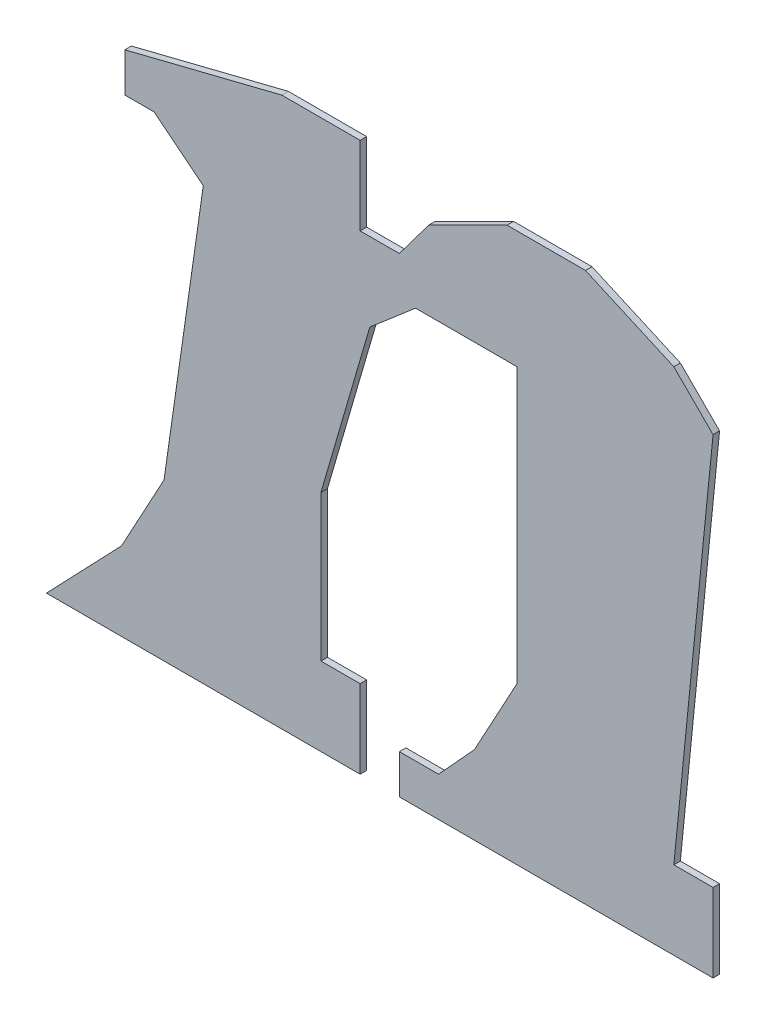
ISO-10303-21;
HEADER;
FILE_DESCRIPTION(('STEP AP214'),'2;1');
FILE_NAME('part.step','',(''),(''),'','','');
FILE_SCHEMA(('AUTOMOTIVE_DESIGN { 1 0 10303 214 1 1 1 1 }'));
ENDSEC;
DATA;
#1=APPLICATION_CONTEXT('core data for automotive mechanical design processes');
#2=APPLICATION_PROTOCOL_DEFINITION('international standard','automotive_design',2000,#1);
#3=PRODUCT_CONTEXT('',#1,'mechanical');
#4=PRODUCT('Part','Part','',(#3));
#5=PRODUCT_RELATED_PRODUCT_CATEGORY('part','',(#4));
#6=PRODUCT_DEFINITION_FORMATION('','',#4);
#7=PRODUCT_DEFINITION_CONTEXT('part definition',#1,'design');
#8=PRODUCT_DEFINITION('design','',#6,#7);
#9=PRODUCT_DEFINITION_SHAPE('','',#8);
#10=(LENGTH_UNIT() NAMED_UNIT(*) SI_UNIT(.MILLI.,.METRE.));
#11=(NAMED_UNIT(*) PLANE_ANGLE_UNIT() SI_UNIT($,.RADIAN.));
#12=(NAMED_UNIT(*) SI_UNIT($,.STERADIAN.) SOLID_ANGLE_UNIT());
#13=UNCERTAINTY_MEASURE_WITH_UNIT(LENGTH_MEASURE(1.E-05),#10,'distance_accuracy_value','');
#14=(GEOMETRIC_REPRESENTATION_CONTEXT(3) GLOBAL_UNCERTAINTY_ASSIGNED_CONTEXT((#13)) GLOBAL_UNIT_ASSIGNED_CONTEXT((#10,
#11,#12)) REPRESENTATION_CONTEXT('',''));
#15=CARTESIAN_POINT('',(0.,0.,0.));
#16=DIRECTION('',(0.,0.,1.));
#17=DIRECTION('',(1.,0.,0.));
#18=AXIS2_PLACEMENT_3D('',#15,#16,#17);
#19=CARTESIAN_POINT('',(-0.50999898,-0.41999916,0.));
#20=DIRECTION('',(0.,0.,-1.));
#21=DIRECTION('',(-1.,0.,0.));
#22=AXIS2_PLACEMENT_3D('',#19,#20,#21);
#23=PLANE('',#22);
#24=DIRECTION('',(0.,1.,0.));
#25=VECTOR('',#24,1.);
#26=CARTESIAN_POINT('',(-0.02999994000001,-0.2999994,0.));
#27=LINE('',#26,#25);
#28=CARTESIAN_POINT('',(-0.02999994000001,-0.41999916,0.));
#29=VERTEX_POINT('',#28);
#30=CARTESIAN_POINT('',(-0.02999994000001,-0.2999994,0.));
#31=VERTEX_POINT('',#30);
#32=EDGE_CURVE('E372',#29,#31,#27,.T.);
#33=ORIENTED_EDGE('',*,*,#32,.F.);
#34=DIRECTION('',(1.,0.,0.));
#35=VECTOR('',#34,1.);
#36=CARTESIAN_POINT('',(-0.02999994000001,-0.41999916,0.));
#37=LINE('',#36,#35);
#38=CARTESIAN_POINT('',(-0.50999898,-0.41999916,0.));
#39=VERTEX_POINT('',#38);
#40=EDGE_CURVE('E220',#39,#29,#37,.T.);
#41=ORIENTED_EDGE('',*,*,#40,.F.);
#42=DIRECTION('',(-0.691351111248092,-0.722518955444096,0.));
#43=VECTOR('',#42,1.);
#44=CARTESIAN_POINT('',(-0.50999898,-0.41999916,0.));
#45=LINE('',#44,#43);
#46=CARTESIAN_POINT('',(-0.395175740000001,-0.299999399999999,0.));
#47=VERTEX_POINT('',#46);
#48=EDGE_CURVE('E20',#47,#39,#45,.T.);
#49=ORIENTED_EDGE('',*,*,#48,.F.);
#50=DIRECTION('',(-0.477274509659104,-0.878754255995191,0.));
#51=VECTOR('',#50,1.);
#52=CARTESIAN_POINT('',(-0.39517574,-0.2999994,0.));
#53=LINE('',#52,#51);
#54=CARTESIAN_POINT('',(-0.329999339999991,-0.179997100000005,0.));
#55=VERTEX_POINT('',#54);
#56=EDGE_CURVE('E217',#55,#47,#53,.T.);
#57=ORIENTED_EDGE('',*,*,#56,.F.);
#58=DIRECTION('',(-0.14142135623703,-0.989949493661207,0.));
#59=VECTOR('',#58,1.);
#60=CARTESIAN_POINT('',(-0.32999934,-0.1799971,0.));
#61=LINE('',#60,#59);
#62=CARTESIAN_POINT('',(-0.269999460000059,0.240002060000009,0.));
#63=VERTEX_POINT('',#62);
#64=EDGE_CURVE('E238',#63,#55,#61,.T.);
#65=ORIENTED_EDGE('',*,*,#64,.F.);
#66=DIRECTION('',(0.781584520739364,-0.623799356316291,0.));
#67=VECTOR('',#66,1.);
#68=CARTESIAN_POINT('',(-0.26999946,0.24000206,0.));
#69=LINE('',#68,#67);
#70=CARTESIAN_POINT('',(-0.34517584000001,0.300001939999988,0.));
#71=VERTEX_POINT('',#70);
#72=EDGE_CURVE('E242',#71,#63,#69,.T.);
#73=ORIENTED_EDGE('',*,*,#72,.F.);
#74=DIRECTION('',(1.,0.,0.));
#75=VECTOR('',#74,1.);
#76=CARTESIAN_POINT('',(-0.34517584,0.30000194,0.));
#77=LINE('',#76,#75);
#78=CARTESIAN_POINT('',(-0.38999922,0.30000194,0.));
#79=VERTEX_POINT('',#78);
#80=EDGE_CURVE('E247',#79,#71,#77,.T.);
#81=ORIENTED_EDGE('',*,*,#80,.F.);
#82=DIRECTION('',(0.,1.,0.));
#83=VECTOR('',#82,1.);
#84=CARTESIAN_POINT('',(-0.38999922,0.30000194,0.));
#85=LINE('',#84,#83);
#86=CARTESIAN_POINT('',(-0.38999922,0.36000182,0.));
#87=VERTEX_POINT('',#86);
#88=EDGE_CURVE('E252',#87,#79,#85,.F.);
#89=ORIENTED_EDGE('',*,*,#88,.F.);
#90=DIRECTION('',(-0.970142500145391,-0.242535625036098,0.));
#91=VECTOR('',#90,1.);
#92=CARTESIAN_POINT('',(-0.38999922,0.36000182,0.));
#93=LINE('',#92,#91);
#94=CARTESIAN_POINT('',(-0.149999699999993,0.420001699999971,0.));
#95=VERTEX_POINT('',#94);
#96=EDGE_CURVE('E257',#95,#87,#93,.T.);
#97=ORIENTED_EDGE('',*,*,#96,.F.);
#98=DIRECTION('',(1.,0.,0.));
#99=VECTOR('',#98,1.);
#100=CARTESIAN_POINT('',(-0.1499997,0.4200017,0.));
#101=LINE('',#100,#99);
#102=CARTESIAN_POINT('',(-0.02999994000001,0.4200017,0.));
#103=VERTEX_POINT('',#102);
#104=EDGE_CURVE('E262',#103,#95,#101,.F.);
#105=ORIENTED_EDGE('',*,*,#104,.F.);
#106=DIRECTION('',(0.,1.,0.));
#107=VECTOR('',#106,1.);
#108=CARTESIAN_POINT('',(-0.02999994000001,0.4200017,0.));
#109=LINE('',#108,#107);
#110=CARTESIAN_POINT('',(-0.02999994000001,0.30000194,0.));
#111=VERTEX_POINT('',#110);
#112=EDGE_CURVE('E267',#111,#103,#109,.T.);
#113=ORIENTED_EDGE('',*,*,#112,.F.);
#114=DIRECTION('',(1.,0.,0.));
#115=VECTOR('',#114,1.);
#116=CARTESIAN_POINT('',(-0.02999994000001,0.30000194,0.));
#117=LINE('',#116,#115);
#118=CARTESIAN_POINT('',(0.03000247999999,0.30000194,0.));
#119=VERTEX_POINT('',#118);
#120=EDGE_CURVE('E272',#119,#111,#117,.F.);
#121=ORIENTED_EDGE('',*,*,#120,.F.);
#122=DIRECTION('',(-0.598468645884806,-0.80114622878274,0.));
#123=VECTOR('',#122,1.);
#124=CARTESIAN_POINT('',(0.03000247999999,0.30000194,0.));
#125=LINE('',#124,#123);
#126=CARTESIAN_POINT('',(0.0748233199999805,0.360001820000007,0.));
#127=VERTEX_POINT('',#126);
#128=EDGE_CURVE('E277',#127,#119,#125,.T.);
#129=ORIENTED_EDGE('',*,*,#128,.F.);
#130=DIRECTION('',(-0.894427190999916,-0.447213595499958,0.));
#131=VECTOR('',#130,1.);
#132=CARTESIAN_POINT('',(0.07482331999999,0.36000182,0.));
#133=LINE('',#132,#131);
#134=CARTESIAN_POINT('',(0.194823079999999,0.420001700000002,0.));
#135=VERTEX_POINT('',#134);
#136=EDGE_CURVE('E282',#135,#127,#133,.T.);
#137=ORIENTED_EDGE('',*,*,#136,.F.);
#138=DIRECTION('',(1.,0.,0.));
#139=VECTOR('',#138,1.);
#140=CARTESIAN_POINT('',(0.19482308,0.4200017,0.));
#141=LINE('',#140,#139);
#142=CARTESIAN_POINT('',(0.31482284,0.4200017,0.));
#143=VERTEX_POINT('',#142);
#144=EDGE_CURVE('E287',#143,#135,#141,.F.);
#145=ORIENTED_EDGE('',*,*,#144,.F.);
#146=DIRECTION('',(-0.914011154655173,0.405689054777077,0.));
#147=VECTOR('',#146,1.);
#148=CARTESIAN_POINT('',(0.31482284,0.4200017,0.));
#149=LINE('',#148,#147);
#150=CARTESIAN_POINT('',(0.450001640000015,0.360001820000033,0.));
#151=VERTEX_POINT('',#150);
#152=EDGE_CURVE('E292',#151,#143,#149,.T.);
#153=ORIENTED_EDGE('',*,*,#152,.F.);
#154=DIRECTION('',(-0.707106781186048,0.707106781187048,0.));
#155=VECTOR('',#154,1.);
#156=CARTESIAN_POINT('',(0.45000164,0.36000182,0.));
#157=LINE('',#156,#155);
#158=CARTESIAN_POINT('',(0.510001519999979,0.300001939999979,0.));
#159=VERTEX_POINT('',#158);
#160=EDGE_CURVE('E297',#159,#151,#157,.T.);
#161=ORIENTED_EDGE('',*,*,#160,.F.);
#162=DIRECTION('',(0.0995033019600991,0.995037231915991,0.));
#163=VECTOR('',#162,1.);
#164=CARTESIAN_POINT('',(0.51000152,0.30000194,0.));
#165=LINE('',#164,#163);
#166=CARTESIAN_POINT('',(0.450001640000004,-0.2999994,0.));
#167=VERTEX_POINT('',#166);
#168=EDGE_CURVE('E302',#167,#159,#165,.T.);
#169=ORIENTED_EDGE('',*,*,#168,.F.);
#170=DIRECTION('',(1.,0.,0.));
#171=VECTOR('',#170,1.);
#172=CARTESIAN_POINT('',(0.45000164,-0.2999994,0.));
#173=LINE('',#172,#171);
#174=CARTESIAN_POINT('',(0.51000152,-0.2999994,0.));
#175=VERTEX_POINT('',#174);
#176=EDGE_CURVE('E307',#175,#167,#173,.F.);
#177=ORIENTED_EDGE('',*,*,#176,.F.);
#178=DIRECTION('',(0.,1.,0.));
#179=VECTOR('',#178,1.);
#180=CARTESIAN_POINT('',(0.51000152,-0.2999994,0.));
#181=LINE('',#180,#179);
#182=CARTESIAN_POINT('',(0.51000152,-0.41999916,0.));
#183=VERTEX_POINT('',#182);
#184=EDGE_CURVE('E312',#183,#175,#181,.T.);
#185=ORIENTED_EDGE('',*,*,#184,.F.);
#186=DIRECTION('',(1.,0.,0.));
#187=VECTOR('',#186,1.);
#188=CARTESIAN_POINT('',(0.51000152,-0.41999916,0.));
#189=LINE('',#188,#187);
#190=CARTESIAN_POINT('',(0.03000247999999,-0.41999916,0.));
#191=VERTEX_POINT('',#190);
#192=EDGE_CURVE('E317',#191,#183,#189,.T.);
#193=ORIENTED_EDGE('',*,*,#192,.F.);
#194=DIRECTION('',(0.,1.,0.));
#195=VECTOR('',#194,1.);
#196=CARTESIAN_POINT('',(0.03000247999999,-0.41999916,0.));
#197=LINE('',#196,#195);
#198=CARTESIAN_POINT('',(0.03000247999999,-0.35999928,0.));
#199=VERTEX_POINT('',#198);
#200=EDGE_CURVE('E322',#199,#191,#197,.F.);
#201=ORIENTED_EDGE('',*,*,#200,.F.);
#202=DIRECTION('',(1.,0.,0.));
#203=VECTOR('',#202,1.);
#204=CARTESIAN_POINT('',(0.03000247999999,-0.35999928,0.));
#205=LINE('',#204,#203);
#206=CARTESIAN_POINT('',(0.09000236,-0.35999928,0.));
#207=VERTEX_POINT('',#206);
#208=EDGE_CURVE('E327',#207,#199,#205,.F.);
#209=ORIENTED_EDGE('',*,*,#208,.F.);
#210=DIRECTION('',(-0.674526464992905,-0.738250667472896,0.));
#211=VECTOR('',#210,1.);
#212=CARTESIAN_POINT('',(0.09000236,-0.35999928,0.));
#213=LINE('',#212,#211);
#214=CARTESIAN_POINT('',(0.144823179999995,-0.299999399999996,0.));
#215=VERTEX_POINT('',#214);
#216=EDGE_CURVE('E332',#215,#207,#213,.T.);
#217=ORIENTED_EDGE('',*,*,#216,.F.);
#218=DIRECTION('',(-0.477288872511084,-0.878746455001156,0.));
#219=VECTOR('',#218,1.);
#220=CARTESIAN_POINT('',(0.14482318,-0.2999994,0.));
#221=LINE('',#220,#219);
#222=CARTESIAN_POINT('',(0.210002120000002,-0.179997100000001,0.));
#223=VERTEX_POINT('',#222);
#224=EDGE_CURVE('E337',#223,#215,#221,.T.);
#225=ORIENTED_EDGE('',*,*,#224,.F.);
#226=DIRECTION('',(0.,1.,0.));
#227=VECTOR('',#226,1.);
#228=CARTESIAN_POINT('',(0.21000212,-0.1799971,0.));
#229=LINE('',#228,#227);
#230=CARTESIAN_POINT('',(0.21000212,0.24000206,0.));
#231=VERTEX_POINT('',#230);
#232=EDGE_CURVE('E342',#231,#223,#229,.F.);
#233=ORIENTED_EDGE('',*,*,#232,.F.);
#234=DIRECTION('',(1.,0.,0.));
#235=VECTOR('',#234,1.);
#236=CARTESIAN_POINT('',(0.21000212,0.24000206,0.));
#237=LINE('',#236,#235);
#238=CARTESIAN_POINT('',(0.05482336,0.24000206,0.));
#239=VERTEX_POINT('',#238);
#240=EDGE_CURVE('E347',#239,#231,#237,.T.);
#241=ORIENTED_EDGE('',*,*,#240,.F.);
#242=DIRECTION('',(0.759256602365155,0.650791373456133,0.));
#243=VECTOR('',#242,1.);
#244=CARTESIAN_POINT('',(0.05482336,0.24000206,0.));
#245=LINE('',#244,#243);
#246=CARTESIAN_POINT('',(-0.0151765000000014,0.18000217999999,0.));
#247=VERTEX_POINT('',#246);
#248=EDGE_CURVE('E352',#247,#239,#245,.T.);
#249=ORIENTED_EDGE('',*,*,#248,.F.);
#250=DIRECTION('',(0.279877048661076,0.960035852264261,0.));
#251=VECTOR('',#250,1.);
#252=CARTESIAN_POINT('',(-0.01517650000001,0.18000218,0.));
#253=LINE('',#252,#251);
#254=CARTESIAN_POINT('',(-0.0899998200000719,-0.076657199999979,0.));
#255=VERTEX_POINT('',#254);
#256=EDGE_CURVE('E357',#255,#247,#253,.T.);
#257=ORIENTED_EDGE('',*,*,#256,.F.);
#258=DIRECTION('',(0.,1.,0.));
#259=VECTOR('',#258,1.);
#260=CARTESIAN_POINT('',(-0.08999982,-0.0766572,0.));
#261=LINE('',#260,#259);
#262=CARTESIAN_POINT('',(-0.08999982,-0.2999994,0.));
#263=VERTEX_POINT('',#262);
#264=EDGE_CURVE('E362',#263,#255,#261,.T.);
#265=ORIENTED_EDGE('',*,*,#264,.F.);
#266=DIRECTION('',(1.,0.,0.));
#267=VECTOR('',#266,1.);
#268=CARTESIAN_POINT('',(-0.08999982,-0.2999994,0.));
#269=LINE('',#268,#267);
#270=EDGE_CURVE('E367',#31,#263,#269,.F.);
#271=ORIENTED_EDGE('',*,*,#270,.F.);
#272=EDGE_LOOP('',(#33,#41,#49,#57,#65,#73,#81,#89,#97,#105,#113,#121,#129,#137,#145,#153,#161,
#169,#177,#185,#193,#201,#209,#217,#225,#233,#241,#249,#257,#265,#271));
#273=FACE_BOUND('',#272,.T.);
#274=ADVANCED_FACE('F17',(#273),#23,.T.);
#275=CARTESIAN_POINT('',(-0.50999898,-0.41999916,0.));
#276=DIRECTION('',(-0.722518955444096,0.691351111248092,0.));
#277=DIRECTION('',(-0.691351111248092,-0.722518955444096,0.));
#278=AXIS2_PLACEMENT_3D('',#275,#276,#277);
#279=PLANE('',#278);
#280=DIRECTION('',(0.,0.,1.));
#281=VECTOR('',#280,1.);
#282=CARTESIAN_POINT('',(-0.39517574,-0.2999994,0.));
#283=LINE('',#282,#281);
#284=CARTESIAN_POINT('',(-0.395175740000001,-0.299999399999999,0.01));
#285=VERTEX_POINT('',#284);
#286=EDGE_CURVE('E225',#47,#285,#283,.T.);
#287=ORIENTED_EDGE('',*,*,#286,.F.);
#288=ORIENTED_EDGE('',*,*,#48,.T.);
#289=DIRECTION('',(0.,0.,-1.));
#290=VECTOR('',#289,1.);
#291=CARTESIAN_POINT('',(-0.50999898,-0.41999916,0.));
#292=LINE('',#291,#290);
#293=CARTESIAN_POINT('',(-0.50999898,-0.41999916,0.01));
#294=VERTEX_POINT('',#293);
#295=EDGE_CURVE('E376',#294,#39,#292,.T.);
#296=ORIENTED_EDGE('',*,*,#295,.F.);
#297=DIRECTION('',(0.691351111248103,0.722518955444086,0.));
#298=VECTOR('',#297,1.);
#299=CARTESIAN_POINT('',(-0.50999898,-0.41999916,0.01));
#300=LINE('',#299,#298);
#301=EDGE_CURVE('E235',#294,#285,#300,.T.);
#302=ORIENTED_EDGE('',*,*,#301,.T.);
#303=EDGE_LOOP('',(#287,#288,#296,#302));
#304=FACE_BOUND('',#303,.T.);
#305=ADVANCED_FACE('F234',(#304),#279,.T.);
#306=CARTESIAN_POINT('',(-0.39517574,-0.2999994,0.));
#307=DIRECTION('',(-0.878754255995191,0.477274509659104,0.));
#308=DIRECTION('',(-0.477274509659104,-0.878754255995191,0.));
#309=AXIS2_PLACEMENT_3D('',#306,#307,#308);
#310=PLANE('',#309);
#311=DIRECTION('',(0.,0.,1.));
#312=VECTOR('',#311,1.);
#313=CARTESIAN_POINT('',(-0.32999934,-0.1799971,0.));
#314=LINE('',#313,#312);
#315=CARTESIAN_POINT('',(-0.329999339999991,-0.179997100000005,0.01));
#316=VERTEX_POINT('',#315);
#317=EDGE_CURVE('E231',#55,#316,#314,.T.);
#318=ORIENTED_EDGE('',*,*,#317,.F.);
#319=ORIENTED_EDGE('',*,*,#56,.T.);
#320=ORIENTED_EDGE('',*,*,#286,.T.);
#321=DIRECTION('',(0.477274509658977,0.87875425599526,0.));
#322=VECTOR('',#321,1.);
#323=CARTESIAN_POINT('',(-0.39517574,-0.2999994,0.01));
#324=LINE('',#323,#322);
#325=EDGE_CURVE('E380',#285,#316,#324,.T.);
#326=ORIENTED_EDGE('',*,*,#325,.T.);
#327=EDGE_LOOP('',(#318,#319,#320,#326));
#328=FACE_BOUND('',#327,.T.);
#329=ADVANCED_FACE('F228',(#328),#310,.T.);
#330=CARTESIAN_POINT('',(-0.32999934,-0.1799971,0.));
#331=DIRECTION('',(-0.989949493661207,0.14142135623703,0.));
#332=DIRECTION('',(-0.14142135623703,-0.989949493661207,0.));
#333=AXIS2_PLACEMENT_3D('',#330,#331,#332);
#334=PLANE('',#333);
#335=DIRECTION('',(0.,0.,1.));
#336=VECTOR('',#335,1.);
#337=CARTESIAN_POINT('',(-0.26999946,0.24000206,0.));
#338=LINE('',#337,#336);
#339=CARTESIAN_POINT('',(-0.269999460000059,0.240002060000009,0.01));
#340=VERTEX_POINT('',#339);
#341=EDGE_CURVE('E240',#63,#340,#338,.T.);
#342=ORIENTED_EDGE('',*,*,#341,.F.);
#343=ORIENTED_EDGE('',*,*,#64,.T.);
#344=ORIENTED_EDGE('',*,*,#317,.T.);
#345=DIRECTION('',(0.141421356237309,0.989949493661166,0.));
#346=VECTOR('',#345,1.);
#347=CARTESIAN_POINT('',(-0.32999934,-0.1799971,0.01));
#348=LINE('',#347,#346);
#349=EDGE_CURVE('E382',#316,#340,#348,.T.);
#350=ORIENTED_EDGE('',*,*,#349,.T.);
#351=EDGE_LOOP('',(#342,#343,#344,#350));
#352=FACE_BOUND('',#351,.T.);
#353=ADVANCED_FACE('F576',(#352),#334,.T.);
#354=CARTESIAN_POINT('',(-0.26999946,0.24000206,0.));
#355=DIRECTION('',(-0.623799356316291,-0.781584520739364,0.));
#356=DIRECTION('',(0.781584520739364,-0.623799356316291,0.));
#357=AXIS2_PLACEMENT_3D('',#354,#355,#356);
#358=PLANE('',#357);
#359=DIRECTION('',(0.,0.,-1.));
#360=VECTOR('',#359,1.);
#361=CARTESIAN_POINT('',(-0.34517584,0.30000194,0.));
#362=LINE('',#361,#360);
#363=CARTESIAN_POINT('',(-0.34517584000001,0.300001939999988,0.01));
#364=VERTEX_POINT('',#363);
#365=EDGE_CURVE('E245',#71,#364,#362,.F.);
#366=ORIENTED_EDGE('',*,*,#365,.F.);
#367=ORIENTED_EDGE('',*,*,#72,.T.);
#368=ORIENTED_EDGE('',*,*,#341,.T.);
#369=DIRECTION('',(-0.781584520739166,0.623799356316539,0.));
#370=VECTOR('',#369,1.);
#371=CARTESIAN_POINT('',(-0.26999946,0.24000206,0.01));
#372=LINE('',#371,#370);
#373=EDGE_CURVE('E385',#340,#364,#372,.T.);
#374=ORIENTED_EDGE('',*,*,#373,.T.);
#375=EDGE_LOOP('',(#366,#367,#368,#374));
#376=FACE_BOUND('',#375,.T.);
#377=ADVANCED_FACE('F572',(#376),#358,.T.);
#378=CARTESIAN_POINT('',(-0.34517584,0.30000194,0.));
#379=DIRECTION('',(0.,-1.,0.));
#380=DIRECTION('',(0.,0.,-1.));
#381=AXIS2_PLACEMENT_3D('',#378,#379,#380);
#382=PLANE('',#381);
#383=DIRECTION('',(0.,0.,1.));
#384=VECTOR('',#383,1.);
#385=CARTESIAN_POINT('',(-0.38999922,0.30000194,0.));
#386=LINE('',#385,#384);
#387=CARTESIAN_POINT('',(-0.38999922,0.30000194,0.01));
#388=VERTEX_POINT('',#387);
#389=EDGE_CURVE('E250',#79,#388,#386,.T.);
#390=ORIENTED_EDGE('',*,*,#389,.F.);
#391=ORIENTED_EDGE('',*,*,#80,.T.);
#392=ORIENTED_EDGE('',*,*,#365,.T.);
#393=DIRECTION('',(-1.,0.,0.));
#394=VECTOR('',#393,1.);
#395=CARTESIAN_POINT('',(-0.50999898,0.30000194,0.01));
#396=LINE('',#395,#394);
#397=EDGE_CURVE('E388',#364,#388,#396,.T.);
#398=ORIENTED_EDGE('',*,*,#397,.T.);
#399=EDGE_LOOP('',(#390,#391,#392,#398));
#400=FACE_BOUND('',#399,.T.);
#401=ADVANCED_FACE('F569',(#400),#382,.T.);
#402=CARTESIAN_POINT('',(-0.38999922,0.30000194,0.));
#403=DIRECTION('',(-1.,0.,0.));
#404=DIRECTION('',(0.,0.,1.));
#405=AXIS2_PLACEMENT_3D('',#402,#403,#404);
#406=PLANE('',#405);
#407=DIRECTION('',(0.,0.,1.));
#408=VECTOR('',#407,1.);
#409=CARTESIAN_POINT('',(-0.38999922,0.36000182,0.));
#410=LINE('',#409,#408);
#411=CARTESIAN_POINT('',(-0.38999922,0.36000182,0.01));
#412=VERTEX_POINT('',#411);
#413=EDGE_CURVE('E255',#87,#412,#410,.T.);
#414=ORIENTED_EDGE('',*,*,#413,.F.);
#415=ORIENTED_EDGE('',*,*,#88,.T.);
#416=ORIENTED_EDGE('',*,*,#389,.T.);
#417=DIRECTION('',(0.,1.,0.));
#418=VECTOR('',#417,1.);
#419=CARTESIAN_POINT('',(-0.38999922,-0.41999916,0.01));
#420=LINE('',#419,#418);
#421=EDGE_CURVE('E391',#388,#412,#420,.T.);
#422=ORIENTED_EDGE('',*,*,#421,.T.);
#423=EDGE_LOOP('',(#414,#415,#416,#422));
#424=FACE_BOUND('',#423,.T.);
#425=ADVANCED_FACE('F564',(#424),#406,.T.);
#426=CARTESIAN_POINT('',(-0.38999922,0.36000182,0.));
#427=DIRECTION('',(-0.242535625036098,0.970142500145391,0.));
#428=DIRECTION('',(-0.970142500145391,-0.242535625036098,0.));
#429=AXIS2_PLACEMENT_3D('',#426,#427,#428);
#430=PLANE('',#429);
#431=DIRECTION('',(0.,0.,1.));
#432=VECTOR('',#431,1.);
#433=CARTESIAN_POINT('',(-0.1499997,0.4200017,0.));
#434=LINE('',#433,#432);
#435=CARTESIAN_POINT('',(-0.149999699999993,0.420001699999971,0.01));
#436=VERTEX_POINT('',#435);
#437=EDGE_CURVE('E260',#95,#436,#434,.T.);
#438=ORIENTED_EDGE('',*,*,#437,.F.);
#439=ORIENTED_EDGE('',*,*,#96,.T.);
#440=ORIENTED_EDGE('',*,*,#413,.T.);
#441=DIRECTION('',(0.970142500145332,0.242535625036333,0.));
#442=VECTOR('',#441,1.);
#443=CARTESIAN_POINT('',(-0.38999922,0.36000182,0.01));
#444=LINE('',#443,#442);
#445=EDGE_CURVE('E394',#412,#436,#444,.T.);
#446=ORIENTED_EDGE('',*,*,#445,.T.);
#447=EDGE_LOOP('',(#438,#439,#440,#446));
#448=FACE_BOUND('',#447,.T.);
#449=ADVANCED_FACE('F561',(#448),#430,.T.);
#450=CARTESIAN_POINT('',(-0.1499997,0.4200017,0.));
#451=DIRECTION('',(0.,1.,0.));
#452=DIRECTION('',(0.,0.,1.));
#453=AXIS2_PLACEMENT_3D('',#450,#451,#452);
#454=PLANE('',#453);
#455=DIRECTION('',(0.,0.,-1.));
#456=VECTOR('',#455,1.);
#457=CARTESIAN_POINT('',(-0.02999994000001,0.4200017,0.));
#458=LINE('',#457,#456);
#459=CARTESIAN_POINT('',(-0.02999994000001,0.4200017,0.01));
#460=VERTEX_POINT('',#459);
#461=EDGE_CURVE('E265',#103,#460,#458,.F.);
#462=ORIENTED_EDGE('',*,*,#461,.F.);
#463=ORIENTED_EDGE('',*,*,#104,.T.);
#464=ORIENTED_EDGE('',*,*,#437,.T.);
#465=DIRECTION('',(-1.,0.,0.));
#466=VECTOR('',#465,1.);
#467=CARTESIAN_POINT('',(-0.50999898,0.4200017,0.01));
#468=LINE('',#467,#466);
#469=EDGE_CURVE('E397',#436,#460,#468,.F.);
#470=ORIENTED_EDGE('',*,*,#469,.T.);
#471=EDGE_LOOP('',(#462,#463,#464,#470));
#472=FACE_BOUND('',#471,.T.);
#473=ADVANCED_FACE('F556',(#472),#454,.T.);
#474=CARTESIAN_POINT('',(-0.02999994000001,0.4200017,0.));
#475=DIRECTION('',(1.,0.,0.));
#476=DIRECTION('',(0.,0.,-1.));
#477=AXIS2_PLACEMENT_3D('',#474,#475,#476);
#478=PLANE('',#477);
#479=DIRECTION('',(0.,0.,1.));
#480=VECTOR('',#479,1.);
#481=CARTESIAN_POINT('',(-0.02999994000001,0.30000194,0.));
#482=LINE('',#481,#480);
#483=CARTESIAN_POINT('',(-0.02999994000001,0.30000194,0.01));
#484=VERTEX_POINT('',#483);
#485=EDGE_CURVE('E270',#111,#484,#482,.T.);
#486=ORIENTED_EDGE('',*,*,#485,.F.);
#487=ORIENTED_EDGE('',*,*,#112,.T.);
#488=ORIENTED_EDGE('',*,*,#461,.T.);
#489=DIRECTION('',(0.,1.,0.));
#490=VECTOR('',#489,1.);
#491=CARTESIAN_POINT('',(-0.02999994000001,-0.41999916,0.01));
#492=LINE('',#491,#490);
#493=EDGE_CURVE('E400',#460,#484,#492,.F.);
#494=ORIENTED_EDGE('',*,*,#493,.T.);
#495=EDGE_LOOP('',(#486,#487,#488,#494));
#496=FACE_BOUND('',#495,.T.);
#497=ADVANCED_FACE('F553',(#496),#478,.T.);
#498=CARTESIAN_POINT('',(-0.02999994000001,0.30000194,0.));
#499=DIRECTION('',(0.,1.,0.));
#500=DIRECTION('',(0.,0.,1.));
#501=AXIS2_PLACEMENT_3D('',#498,#499,#500);
#502=PLANE('',#501);
#503=DIRECTION('',(0.,0.,1.));
#504=VECTOR('',#503,1.);
#505=CARTESIAN_POINT('',(0.03000247999999,0.30000194,0.));
#506=LINE('',#505,#504);
#507=CARTESIAN_POINT('',(0.03000247999999,0.30000194,0.01));
#508=VERTEX_POINT('',#507);
#509=EDGE_CURVE('E275',#119,#508,#506,.T.);
#510=ORIENTED_EDGE('',*,*,#509,.F.);
#511=ORIENTED_EDGE('',*,*,#120,.T.);
#512=ORIENTED_EDGE('',*,*,#485,.T.);
#513=DIRECTION('',(-1.,0.,0.));
#514=VECTOR('',#513,1.);
#515=CARTESIAN_POINT('',(-0.50999898,0.30000194,0.01));
#516=LINE('',#515,#514);
#517=EDGE_CURVE('E403',#484,#508,#516,.F.);
#518=ORIENTED_EDGE('',*,*,#517,.T.);
#519=EDGE_LOOP('',(#510,#511,#512,#518));
#520=FACE_BOUND('',#519,.T.);
#521=ADVANCED_FACE('F548',(#520),#502,.T.);
#522=CARTESIAN_POINT('',(0.03000247999999,0.30000194,0.));
#523=DIRECTION('',(-0.80114622878274,0.598468645884806,0.));
#524=DIRECTION('',(-0.598468645884806,-0.80114622878274,0.));
#525=AXIS2_PLACEMENT_3D('',#522,#523,#524);
#526=PLANE('',#525);
#527=DIRECTION('',(0.,0.,1.));
#528=VECTOR('',#527,1.);
#529=CARTESIAN_POINT('',(0.07482331999999,0.36000182,0.));
#530=LINE('',#529,#528);
#531=CARTESIAN_POINT('',(0.0748233199999804,0.360001820000007,0.01));
#532=VERTEX_POINT('',#531);
#533=EDGE_CURVE('E280',#127,#532,#530,.T.);
#534=ORIENTED_EDGE('',*,*,#533,.F.);
#535=ORIENTED_EDGE('',*,*,#128,.T.);
#536=ORIENTED_EDGE('',*,*,#509,.T.);
#537=DIRECTION('',(0.598468645885061,0.80114622878255,0.));
#538=VECTOR('',#537,1.);
#539=CARTESIAN_POINT('',(0.03000247999999,0.30000194,0.01));
#540=LINE('',#539,#538);
#541=EDGE_CURVE('E406',#508,#532,#540,.T.);
#542=ORIENTED_EDGE('',*,*,#541,.T.);
#543=EDGE_LOOP('',(#534,#535,#536,#542));
#544=FACE_BOUND('',#543,.T.);
#545=ADVANCED_FACE('F545',(#544),#526,.T.);
#546=CARTESIAN_POINT('',(0.07482331999999,0.36000182,0.));
#547=DIRECTION('',(-0.447213595499958,0.894427190999916,0.));
#548=DIRECTION('',(-0.894427190999916,-0.447213595499958,0.));
#549=AXIS2_PLACEMENT_3D('',#546,#547,#548);
#550=PLANE('',#549);
#551=DIRECTION('',(0.,0.,1.));
#552=VECTOR('',#551,1.);
#553=CARTESIAN_POINT('',(0.19482308,0.4200017,0.));
#554=LINE('',#553,#552);
#555=CARTESIAN_POINT('',(0.194823079999999,0.420001700000002,0.01));
#556=VERTEX_POINT('',#555);
#557=EDGE_CURVE('E285',#135,#556,#554,.T.);
#558=ORIENTED_EDGE('',*,*,#557,.F.);
#559=ORIENTED_EDGE('',*,*,#136,.T.);
#560=ORIENTED_EDGE('',*,*,#533,.T.);
#561=DIRECTION('',(0.894427190999931,0.447213595499929,0.));
#562=VECTOR('',#561,1.);
#563=CARTESIAN_POINT('',(0.07482331999999,0.36000182,0.01));
#564=LINE('',#563,#562);
#565=EDGE_CURVE('E409',#532,#556,#564,.T.);
#566=ORIENTED_EDGE('',*,*,#565,.T.);
#567=EDGE_LOOP('',(#558,#559,#560,#566));
#568=FACE_BOUND('',#567,.T.);
#569=ADVANCED_FACE('F540',(#568),#550,.T.);
#570=CARTESIAN_POINT('',(0.19482308,0.4200017,0.));
#571=DIRECTION('',(0.,1.,0.));
#572=DIRECTION('',(0.,0.,1.));
#573=AXIS2_PLACEMENT_3D('',#570,#571,#572);
#574=PLANE('',#573);
#575=DIRECTION('',(0.,0.,1.));
#576=VECTOR('',#575,1.);
#577=CARTESIAN_POINT('',(0.31482284,0.4200017,0.));
#578=LINE('',#577,#576);
#579=CARTESIAN_POINT('',(0.31482284,0.4200017,0.01));
#580=VERTEX_POINT('',#579);
#581=EDGE_CURVE('E290',#143,#580,#578,.T.);
#582=ORIENTED_EDGE('',*,*,#581,.F.);
#583=ORIENTED_EDGE('',*,*,#144,.T.);
#584=ORIENTED_EDGE('',*,*,#557,.T.);
#585=DIRECTION('',(-1.,0.,0.));
#586=VECTOR('',#585,1.);
#587=CARTESIAN_POINT('',(-0.50999898,0.4200017,0.01));
#588=LINE('',#587,#586);
#589=EDGE_CURVE('E412',#556,#580,#588,.F.);
#590=ORIENTED_EDGE('',*,*,#589,.T.);
#591=EDGE_LOOP('',(#582,#583,#584,#590));
#592=FACE_BOUND('',#591,.T.);
#593=ADVANCED_FACE('F537',(#592),#574,.T.);
#594=CARTESIAN_POINT('',(0.31482284,0.4200017,0.));
#595=DIRECTION('',(0.405689054777077,0.914011154655173,0.));
#596=DIRECTION('',(-0.914011154655173,0.405689054777077,0.));
#597=AXIS2_PLACEMENT_3D('',#594,#595,#596);
#598=PLANE('',#597);
#599=DIRECTION('',(0.,0.,1.));
#600=VECTOR('',#599,1.);
#601=CARTESIAN_POINT('',(0.45000164,0.36000182,0.));
#602=LINE('',#601,#600);
#603=CARTESIAN_POINT('',(0.450001640000015,0.360001820000033,0.01));
#604=VERTEX_POINT('',#603);
#605=EDGE_CURVE('E295',#151,#604,#602,.T.);
#606=ORIENTED_EDGE('',*,*,#605,.F.);
#607=ORIENTED_EDGE('',*,*,#152,.T.);
#608=ORIENTED_EDGE('',*,*,#581,.T.);
#609=DIRECTION('',(0.914011154654974,-0.405689054777524,0.));
#610=VECTOR('',#609,1.);
#611=CARTESIAN_POINT('',(0.31482284,0.4200017,0.01));
#612=LINE('',#611,#610);
#613=EDGE_CURVE('E415',#580,#604,#612,.T.);
#614=ORIENTED_EDGE('',*,*,#613,.T.);
#615=EDGE_LOOP('',(#606,#607,#608,#614));
#616=FACE_BOUND('',#615,.T.);
#617=ADVANCED_FACE('F532',(#616),#598,.T.);
#618=CARTESIAN_POINT('',(0.45000164,0.36000182,0.));
#619=DIRECTION('',(0.707106781187048,0.707106781186048,0.));
#620=DIRECTION('',(-0.707106781186048,0.707106781187048,0.));
#621=AXIS2_PLACEMENT_3D('',#618,#619,#620);
#622=PLANE('',#621);
#623=DIRECTION('',(0.,0.,1.));
#624=VECTOR('',#623,1.);
#625=CARTESIAN_POINT('',(0.51000152,0.30000194,0.));
#626=LINE('',#625,#624);
#627=CARTESIAN_POINT('',(0.510001519999979,0.300001939999979,0.01));
#628=VERTEX_POINT('',#627);
#629=EDGE_CURVE('E300',#159,#628,#626,.T.);
#630=ORIENTED_EDGE('',*,*,#629,.F.);
#631=ORIENTED_EDGE('',*,*,#160,.T.);
#632=ORIENTED_EDGE('',*,*,#605,.T.);
#633=DIRECTION('',(0.707106781186548,-0.707106781186547,0.));
#634=VECTOR('',#633,1.);
#635=CARTESIAN_POINT('',(0.45000164,0.36000182,0.01));
#636=LINE('',#635,#634);
#637=EDGE_CURVE('E418',#604,#628,#636,.T.);
#638=ORIENTED_EDGE('',*,*,#637,.T.);
#639=EDGE_LOOP('',(#630,#631,#632,#638));
#640=FACE_BOUND('',#639,.T.);
#641=ADVANCED_FACE('F529',(#640),#622,.T.);
#642=CARTESIAN_POINT('',(0.51000152,0.30000194,0.));
#643=DIRECTION('',(0.995037231915991,-0.0995033019600991,0.));
#644=DIRECTION('',(0.0995033019600991,0.995037231915991,0.));
#645=AXIS2_PLACEMENT_3D('',#642,#643,#644);
#646=PLANE('',#645);
#647=DIRECTION('',(0.,0.,1.));
#648=VECTOR('',#647,1.);
#649=CARTESIAN_POINT('',(0.45000164,-0.2999994,0.));
#650=LINE('',#649,#648);
#651=CARTESIAN_POINT('',(0.450001640000004,-0.2999994,0.01));
#652=VERTEX_POINT('',#651);
#653=EDGE_CURVE('E305',#167,#652,#650,.T.);
#654=ORIENTED_EDGE('',*,*,#653,.F.);
#655=ORIENTED_EDGE('',*,*,#168,.T.);
#656=ORIENTED_EDGE('',*,*,#629,.T.);
#657=DIRECTION('',(-0.0995033019601115,-0.99503723191599,0.));
#658=VECTOR('',#657,1.);
#659=CARTESIAN_POINT('',(0.51000152,0.30000194,0.01));
#660=LINE('',#659,#658);
#661=EDGE_CURVE('E421',#628,#652,#660,.T.);
#662=ORIENTED_EDGE('',*,*,#661,.T.);
#663=EDGE_LOOP('',(#654,#655,#656,#662));
#664=FACE_BOUND('',#663,.T.);
#665=ADVANCED_FACE('F524',(#664),#646,.T.);
#666=CARTESIAN_POINT('',(0.45000164,-0.2999994,0.));
#667=DIRECTION('',(0.,1.,0.));
#668=DIRECTION('',(0.,0.,1.));
#669=AXIS2_PLACEMENT_3D('',#666,#667,#668);
#670=PLANE('',#669);
#671=DIRECTION('',(0.,0.,-1.));
#672=VECTOR('',#671,1.);
#673=CARTESIAN_POINT('',(0.51000152,-0.2999994,0.));
#674=LINE('',#673,#672);
#675=CARTESIAN_POINT('',(0.51000152,-0.2999994,0.01));
#676=VERTEX_POINT('',#675);
#677=EDGE_CURVE('E310',#175,#676,#674,.F.);
#678=ORIENTED_EDGE('',*,*,#677,.F.);
#679=ORIENTED_EDGE('',*,*,#176,.T.);
#680=ORIENTED_EDGE('',*,*,#653,.T.);
#681=DIRECTION('',(-1.,0.,0.));
#682=VECTOR('',#681,1.);
#683=CARTESIAN_POINT('',(-0.50999898,-0.2999994,0.01));
#684=LINE('',#683,#682);
#685=EDGE_CURVE('E424',#652,#676,#684,.F.);
#686=ORIENTED_EDGE('',*,*,#685,.T.);
#687=EDGE_LOOP('',(#678,#679,#680,#686));
#688=FACE_BOUND('',#687,.T.);
#689=ADVANCED_FACE('F521',(#688),#670,.T.);
#690=CARTESIAN_POINT('',(0.51000152,-0.2999994,0.));
#691=DIRECTION('',(1.,0.,0.));
#692=DIRECTION('',(0.,0.,-1.));
#693=AXIS2_PLACEMENT_3D('',#690,#691,#692);
#694=PLANE('',#693);
#695=DIRECTION('',(0.,0.,-1.));
#696=VECTOR('',#695,1.);
#697=CARTESIAN_POINT('',(0.51000152,-0.41999916,0.));
#698=LINE('',#697,#696);
#699=CARTESIAN_POINT('',(0.51000152,-0.41999916,0.01));
#700=VERTEX_POINT('',#699);
#701=EDGE_CURVE('E315',#183,#700,#698,.F.);
#702=ORIENTED_EDGE('',*,*,#701,.F.);
#703=ORIENTED_EDGE('',*,*,#184,.T.);
#704=ORIENTED_EDGE('',*,*,#677,.T.);
#705=DIRECTION('',(0.,1.,0.));
#706=VECTOR('',#705,1.);
#707=CARTESIAN_POINT('',(0.51000152,-0.41999916,0.01));
#708=LINE('',#707,#706);
#709=EDGE_CURVE('E427',#676,#700,#708,.F.);
#710=ORIENTED_EDGE('',*,*,#709,.T.);
#711=EDGE_LOOP('',(#702,#703,#704,#710));
#712=FACE_BOUND('',#711,.T.);
#713=ADVANCED_FACE('F516',(#712),#694,.T.);
#714=CARTESIAN_POINT('',(0.51000152,-0.41999916,0.));
#715=DIRECTION('',(0.,-1.,0.));
#716=DIRECTION('',(0.,0.,-1.));
#717=AXIS2_PLACEMENT_3D('',#714,#715,#716);
#718=PLANE('',#717);
#719=DIRECTION('',(0.,0.,1.));
#720=VECTOR('',#719,1.);
#721=CARTESIAN_POINT('',(0.03000247999999,-0.41999916,0.));
#722=LINE('',#721,#720);
#723=CARTESIAN_POINT('',(0.03000247999999,-0.41999916,0.01));
#724=VERTEX_POINT('',#723);
#725=EDGE_CURVE('E320',#191,#724,#722,.T.);
#726=ORIENTED_EDGE('',*,*,#725,.F.);
#727=ORIENTED_EDGE('',*,*,#192,.T.);
#728=ORIENTED_EDGE('',*,*,#701,.T.);
#729=DIRECTION('',(-1.,0.,0.));
#730=VECTOR('',#729,1.);
#731=CARTESIAN_POINT('',(-0.50999898,-0.41999916,0.01));
#732=LINE('',#731,#730);
#733=EDGE_CURVE('E430',#700,#724,#732,.T.);
#734=ORIENTED_EDGE('',*,*,#733,.T.);
#735=EDGE_LOOP('',(#726,#727,#728,#734));
#736=FACE_BOUND('',#735,.T.);
#737=ADVANCED_FACE('F513',(#736),#718,.T.);
#738=CARTESIAN_POINT('',(0.03000247999999,-0.41999916,0.));
#739=DIRECTION('',(-1.,0.,0.));
#740=DIRECTION('',(0.,0.,1.));
#741=AXIS2_PLACEMENT_3D('',#738,#739,#740);
#742=PLANE('',#741);
#743=DIRECTION('',(0.,0.,1.));
#744=VECTOR('',#743,1.);
#745=CARTESIAN_POINT('',(0.03000247999999,-0.35999928,0.));
#746=LINE('',#745,#744);
#747=CARTESIAN_POINT('',(0.03000247999999,-0.35999928,0.01));
#748=VERTEX_POINT('',#747);
#749=EDGE_CURVE('E325',#199,#748,#746,.T.);
#750=ORIENTED_EDGE('',*,*,#749,.F.);
#751=ORIENTED_EDGE('',*,*,#200,.T.);
#752=ORIENTED_EDGE('',*,*,#725,.T.);
#753=DIRECTION('',(0.,1.,0.));
#754=VECTOR('',#753,1.);
#755=CARTESIAN_POINT('',(0.03000247999999,-0.41999916,0.01));
#756=LINE('',#755,#754);
#757=EDGE_CURVE('E433',#724,#748,#756,.T.);
#758=ORIENTED_EDGE('',*,*,#757,.T.);
#759=EDGE_LOOP('',(#750,#751,#752,#758));
#760=FACE_BOUND('',#759,.T.);
#761=ADVANCED_FACE('F508',(#760),#742,.T.);
#762=CARTESIAN_POINT('',(0.03000247999999,-0.35999928,0.));
#763=DIRECTION('',(0.,1.,0.));
#764=DIRECTION('',(0.,0.,1.));
#765=AXIS2_PLACEMENT_3D('',#762,#763,#764);
#766=PLANE('',#765);
#767=DIRECTION('',(0.,0.,1.));
#768=VECTOR('',#767,1.);
#769=CARTESIAN_POINT('',(0.09000236,-0.35999928,0.));
#770=LINE('',#769,#768);
#771=CARTESIAN_POINT('',(0.09000236,-0.35999928,0.01));
#772=VERTEX_POINT('',#771);
#773=EDGE_CURVE('E330',#207,#772,#770,.T.);
#774=ORIENTED_EDGE('',*,*,#773,.F.);
#775=ORIENTED_EDGE('',*,*,#208,.T.);
#776=ORIENTED_EDGE('',*,*,#749,.T.);
#777=DIRECTION('',(-1.,0.,0.));
#778=VECTOR('',#777,1.);
#779=CARTESIAN_POINT('',(-0.50999898,-0.35999928,0.01));
#780=LINE('',#779,#778);
#781=EDGE_CURVE('E436',#748,#772,#780,.F.);
#782=ORIENTED_EDGE('',*,*,#781,.T.);
#783=EDGE_LOOP('',(#774,#775,#776,#782));
#784=FACE_BOUND('',#783,.T.);
#785=ADVANCED_FACE('F505',(#784),#766,.T.);
#786=CARTESIAN_POINT('',(0.09000236,-0.35999928,0.));
#787=DIRECTION('',(-0.738250667472896,0.674526464992905,0.));
#788=DIRECTION('',(-0.674526464992905,-0.738250667472896,0.));
#789=AXIS2_PLACEMENT_3D('',#786,#787,#788);
#790=PLANE('',#789);
#791=DIRECTION('',(0.,0.,1.));
#792=VECTOR('',#791,1.);
#793=CARTESIAN_POINT('',(0.14482318,-0.2999994,0.));
#794=LINE('',#793,#792);
#795=CARTESIAN_POINT('',(0.144823179999995,-0.299999399999996,0.01));
#796=VERTEX_POINT('',#795);
#797=EDGE_CURVE('E335',#215,#796,#794,.T.);
#798=ORIENTED_EDGE('',*,*,#797,.F.);
#799=ORIENTED_EDGE('',*,*,#216,.T.);
#800=ORIENTED_EDGE('',*,*,#773,.T.);
#801=DIRECTION('',(0.674526464993023,0.738250667472787,0.));
#802=VECTOR('',#801,1.);
#803=CARTESIAN_POINT('',(0.09000236,-0.35999928,0.01));
#804=LINE('',#803,#802);
#805=EDGE_CURVE('E439',#772,#796,#804,.T.);
#806=ORIENTED_EDGE('',*,*,#805,.T.);
#807=EDGE_LOOP('',(#798,#799,#800,#806));
#808=FACE_BOUND('',#807,.T.);
#809=ADVANCED_FACE('F500',(#808),#790,.T.);
#810=CARTESIAN_POINT('',(0.14482318,-0.2999994,0.));
#811=DIRECTION('',(-0.878746455001156,0.477288872511084,0.));
#812=DIRECTION('',(-0.477288872511084,-0.878746455001156,0.));
#813=AXIS2_PLACEMENT_3D('',#810,#811,#812);
#814=PLANE('',#813);
#815=DIRECTION('',(0.,0.,1.));
#816=VECTOR('',#815,1.);
#817=CARTESIAN_POINT('',(0.21000212,-0.1799971,0.));
#818=LINE('',#817,#816);
#819=CARTESIAN_POINT('',(0.210002120000002,-0.179997100000001,0.01));
#820=VERTEX_POINT('',#819);
#821=EDGE_CURVE('E340',#223,#820,#818,.T.);
#822=ORIENTED_EDGE('',*,*,#821,.F.);
#823=ORIENTED_EDGE('',*,*,#224,.T.);
#824=ORIENTED_EDGE('',*,*,#797,.T.);
#825=DIRECTION('',(0.477288872511059,0.878746455001169,0.));
#826=VECTOR('',#825,1.);
#827=CARTESIAN_POINT('',(0.14482318,-0.2999994,0.01));
#828=LINE('',#827,#826);
#829=EDGE_CURVE('E442',#796,#820,#828,.T.);
#830=ORIENTED_EDGE('',*,*,#829,.T.);
#831=EDGE_LOOP('',(#822,#823,#824,#830));
#832=FACE_BOUND('',#831,.T.);
#833=ADVANCED_FACE('F497',(#832),#814,.T.);
#834=CARTESIAN_POINT('',(0.21000212,-0.1799971,0.));
#835=DIRECTION('',(-1.,0.,0.));
#836=DIRECTION('',(0.,0.,1.));
#837=AXIS2_PLACEMENT_3D('',#834,#835,#836);
#838=PLANE('',#837);
#839=DIRECTION('',(0.,0.,-1.));
#840=VECTOR('',#839,1.);
#841=CARTESIAN_POINT('',(0.21000212,0.24000206,0.));
#842=LINE('',#841,#840);
#843=CARTESIAN_POINT('',(0.21000212,0.24000206,0.01));
#844=VERTEX_POINT('',#843);
#845=EDGE_CURVE('E345',#231,#844,#842,.F.);
#846=ORIENTED_EDGE('',*,*,#845,.F.);
#847=ORIENTED_EDGE('',*,*,#232,.T.);
#848=ORIENTED_EDGE('',*,*,#821,.T.);
#849=DIRECTION('',(0.,1.,0.));
#850=VECTOR('',#849,1.);
#851=CARTESIAN_POINT('',(0.21000212,-0.41999916,0.01));
#852=LINE('',#851,#850);
#853=EDGE_CURVE('E445',#820,#844,#852,.T.);
#854=ORIENTED_EDGE('',*,*,#853,.T.);
#855=EDGE_LOOP('',(#846,#847,#848,#854));
#856=FACE_BOUND('',#855,.T.);
#857=ADVANCED_FACE('F492',(#856),#838,.T.);
#858=CARTESIAN_POINT('',(0.21000212,0.24000206,0.));
#859=DIRECTION('',(0.,-1.,0.));
#860=DIRECTION('',(0.,0.,-1.));
#861=AXIS2_PLACEMENT_3D('',#858,#859,#860);
#862=PLANE('',#861);
#863=DIRECTION('',(0.,0.,1.));
#864=VECTOR('',#863,1.);
#865=CARTESIAN_POINT('',(0.05482336,0.24000206,0.));
#866=LINE('',#865,#864);
#867=CARTESIAN_POINT('',(0.05482336,0.24000206,0.01));
#868=VERTEX_POINT('',#867);
#869=EDGE_CURVE('E350',#239,#868,#866,.T.);
#870=ORIENTED_EDGE('',*,*,#869,.F.);
#871=ORIENTED_EDGE('',*,*,#240,.T.);
#872=ORIENTED_EDGE('',*,*,#845,.T.);
#873=DIRECTION('',(-1.,0.,0.));
#874=VECTOR('',#873,1.);
#875=CARTESIAN_POINT('',(-0.50999898,0.24000206,0.01));
#876=LINE('',#875,#874);
#877=EDGE_CURVE('E448',#844,#868,#876,.T.);
#878=ORIENTED_EDGE('',*,*,#877,.T.);
#879=EDGE_LOOP('',(#870,#871,#872,#878));
#880=FACE_BOUND('',#879,.T.);
#881=ADVANCED_FACE('F489',(#880),#862,.T.);
#882=CARTESIAN_POINT('',(0.05482336,0.24000206,0.));
#883=DIRECTION('',(0.650791373456133,-0.759256602365155,0.));
#884=DIRECTION('',(0.759256602365155,0.650791373456133,0.));
#885=AXIS2_PLACEMENT_3D('',#882,#883,#884);
#886=PLANE('',#885);
#887=DIRECTION('',(0.,0.,1.));
#888=VECTOR('',#887,1.);
#889=CARTESIAN_POINT('',(-0.01517650000001,0.18000218,0.));
#890=LINE('',#889,#888);
#891=CARTESIAN_POINT('',(-0.0151765000000014,0.18000217999999,0.01));
#892=VERTEX_POINT('',#891);
#893=EDGE_CURVE('E355',#247,#892,#890,.T.);
#894=ORIENTED_EDGE('',*,*,#893,.F.);
#895=ORIENTED_EDGE('',*,*,#248,.T.);
#896=ORIENTED_EDGE('',*,*,#869,.T.);
#897=DIRECTION('',(-0.759256602365343,-0.650791373455915,0.));
#898=VECTOR('',#897,1.);
#899=CARTESIAN_POINT('',(0.05482336,0.24000206,0.01));
#900=LINE('',#899,#898);
#901=EDGE_CURVE('E451',#868,#892,#900,.T.);
#902=ORIENTED_EDGE('',*,*,#901,.T.);
#903=EDGE_LOOP('',(#894,#895,#896,#902));
#904=FACE_BOUND('',#903,.T.);
#905=ADVANCED_FACE('F484',(#904),#886,.T.);
#906=CARTESIAN_POINT('',(-0.01517650000001,0.18000218,0.));
#907=DIRECTION('',(0.960035852264261,-0.279877048661076,0.));
#908=DIRECTION('',(0.279877048661076,0.960035852264261,0.));
#909=AXIS2_PLACEMENT_3D('',#906,#907,#908);
#910=PLANE('',#909);
#911=DIRECTION('',(0.,0.,-1.));
#912=VECTOR('',#911,1.);
#913=CARTESIAN_POINT('',(-0.08999982,-0.0766572,0.));
#914=LINE('',#913,#912);
#915=CARTESIAN_POINT('',(-0.0899998200000719,-0.076657199999979,0.01));
#916=VERTEX_POINT('',#915);
#917=EDGE_CURVE('E360',#255,#916,#914,.F.);
#918=ORIENTED_EDGE('',*,*,#917,.F.);
#919=ORIENTED_EDGE('',*,*,#256,.T.);
#920=ORIENTED_EDGE('',*,*,#893,.T.);
#921=DIRECTION('',(-0.279877048660538,-0.960035852264418,0.));
#922=VECTOR('',#921,1.);
#923=CARTESIAN_POINT('',(-0.01517650000001,0.18000218,0.01));
#924=LINE('',#923,#922);
#925=EDGE_CURVE('E454',#892,#916,#924,.T.);
#926=ORIENTED_EDGE('',*,*,#925,.T.);
#927=EDGE_LOOP('',(#918,#919,#920,#926));
#928=FACE_BOUND('',#927,.T.);
#929=ADVANCED_FACE('F481',(#928),#910,.T.);
#930=CARTESIAN_POINT('',(-0.08999982,-0.0766572,0.));
#931=DIRECTION('',(1.,0.,0.));
#932=DIRECTION('',(0.,0.,-1.));
#933=AXIS2_PLACEMENT_3D('',#930,#931,#932);
#934=PLANE('',#933);
#935=DIRECTION('',(0.,0.,1.));
#936=VECTOR('',#935,1.);
#937=CARTESIAN_POINT('',(-0.08999982,-0.2999994,0.));
#938=LINE('',#937,#936);
#939=CARTESIAN_POINT('',(-0.08999982,-0.2999994,0.01));
#940=VERTEX_POINT('',#939);
#941=EDGE_CURVE('E365',#263,#940,#938,.T.);
#942=ORIENTED_EDGE('',*,*,#941,.F.);
#943=ORIENTED_EDGE('',*,*,#264,.T.);
#944=ORIENTED_EDGE('',*,*,#917,.T.);
#945=DIRECTION('',(0.,1.,0.));
#946=VECTOR('',#945,1.);
#947=CARTESIAN_POINT('',(-0.08999982,-0.41999916,0.01));
#948=LINE('',#947,#946);
#949=EDGE_CURVE('E457',#916,#940,#948,.F.);
#950=ORIENTED_EDGE('',*,*,#949,.T.);
#951=EDGE_LOOP('',(#942,#943,#944,#950));
#952=FACE_BOUND('',#951,.T.);
#953=ADVANCED_FACE('F476',(#952),#934,.T.);
#954=CARTESIAN_POINT('',(-0.08999982,-0.2999994,0.));
#955=DIRECTION('',(0.,1.,0.));
#956=DIRECTION('',(0.,0.,1.));
#957=AXIS2_PLACEMENT_3D('',#954,#955,#956);
#958=PLANE('',#957);
#959=DIRECTION('',(0.,0.,-1.));
#960=VECTOR('',#959,1.);
#961=CARTESIAN_POINT('',(-0.02999994000001,-0.2999994,0.));
#962=LINE('',#961,#960);
#963=CARTESIAN_POINT('',(-0.02999994000001,-0.2999994,0.01));
#964=VERTEX_POINT('',#963);
#965=EDGE_CURVE('E370',#31,#964,#962,.F.);
#966=ORIENTED_EDGE('',*,*,#965,.F.);
#967=ORIENTED_EDGE('',*,*,#270,.T.);
#968=ORIENTED_EDGE('',*,*,#941,.T.);
#969=DIRECTION('',(-1.,0.,0.));
#970=VECTOR('',#969,1.);
#971=CARTESIAN_POINT('',(-0.50999898,-0.2999994,0.01));
#972=LINE('',#971,#970);
#973=EDGE_CURVE('E460',#940,#964,#972,.F.);
#974=ORIENTED_EDGE('',*,*,#973,.T.);
#975=EDGE_LOOP('',(#966,#967,#968,#974));
#976=FACE_BOUND('',#975,.T.);
#977=ADVANCED_FACE('F473',(#976),#958,.T.);
#978=CARTESIAN_POINT('',(-0.02999994000001,-0.2999994,0.));
#979=DIRECTION('',(1.,0.,0.));
#980=DIRECTION('',(0.,0.,-1.));
#981=AXIS2_PLACEMENT_3D('',#978,#979,#980);
#982=PLANE('',#981);
#983=DIRECTION('',(0.,0.,-1.));
#984=VECTOR('',#983,1.);
#985=CARTESIAN_POINT('',(-0.02999994000001,-0.41999916,0.));
#986=LINE('',#985,#984);
#987=CARTESIAN_POINT('',(-0.02999994000001,-0.41999916,0.01));
#988=VERTEX_POINT('',#987);
#989=EDGE_CURVE('E34',#29,#988,#986,.F.);
#990=ORIENTED_EDGE('',*,*,#989,.F.);
#991=ORIENTED_EDGE('',*,*,#32,.T.);
#992=ORIENTED_EDGE('',*,*,#965,.T.);
#993=DIRECTION('',(0.,1.,0.));
#994=VECTOR('',#993,1.);
#995=CARTESIAN_POINT('',(-0.02999994000001,-0.41999916,0.01));
#996=LINE('',#995,#994);
#997=EDGE_CURVE('E26',#964,#988,#996,.F.);
#998=ORIENTED_EDGE('',*,*,#997,.T.);
#999=EDGE_LOOP('',(#990,#991,#992,#998));
#1000=FACE_BOUND('',#999,.T.);
#1001=ADVANCED_FACE('F466',(#1000),#982,.T.);
#1002=CARTESIAN_POINT('',(-0.02999994000001,-0.41999916,0.));
#1003=DIRECTION('',(0.,-1.,0.));
#1004=DIRECTION('',(0.,0.,-1.));
#1005=AXIS2_PLACEMENT_3D('',#1002,#1003,#1004);
#1006=PLANE('',#1005);
#1007=ORIENTED_EDGE('',*,*,#295,.T.);
#1008=ORIENTED_EDGE('',*,*,#40,.T.);
#1009=ORIENTED_EDGE('',*,*,#989,.T.);
#1010=DIRECTION('',(-1.,0.,0.));
#1011=VECTOR('',#1010,1.);
#1012=CARTESIAN_POINT('',(-0.50999898,-0.41999916,0.01));
#1013=LINE('',#1012,#1011);
#1014=EDGE_CURVE('E11',#988,#294,#1013,.T.);
#1015=ORIENTED_EDGE('',*,*,#1014,.T.);
#1016=EDGE_LOOP('',(#1007,#1008,#1009,#1015));
#1017=FACE_BOUND('',#1016,.T.);
#1018=ADVANCED_FACE('F577',(#1017),#1006,.T.);
#1019=CARTESIAN_POINT('',(-0.50999898,-0.41999916,0.01));
#1020=DIRECTION('',(0.,0.,-1.));
#1021=DIRECTION('',(-1.,0.,0.));
#1022=AXIS2_PLACEMENT_3D('',#1019,#1020,#1021);
#1023=PLANE('',#1022);
#1024=ORIENTED_EDGE('',*,*,#997,.F.);
#1025=ORIENTED_EDGE('',*,*,#973,.F.);
#1026=ORIENTED_EDGE('',*,*,#949,.F.);
#1027=ORIENTED_EDGE('',*,*,#925,.F.);
#1028=ORIENTED_EDGE('',*,*,#901,.F.);
#1029=ORIENTED_EDGE('',*,*,#877,.F.);
#1030=ORIENTED_EDGE('',*,*,#853,.F.);
#1031=ORIENTED_EDGE('',*,*,#829,.F.);
#1032=ORIENTED_EDGE('',*,*,#805,.F.);
#1033=ORIENTED_EDGE('',*,*,#781,.F.);
#1034=ORIENTED_EDGE('',*,*,#757,.F.);
#1035=ORIENTED_EDGE('',*,*,#733,.F.);
#1036=ORIENTED_EDGE('',*,*,#709,.F.);
#1037=ORIENTED_EDGE('',*,*,#685,.F.);
#1038=ORIENTED_EDGE('',*,*,#661,.F.);
#1039=ORIENTED_EDGE('',*,*,#637,.F.);
#1040=ORIENTED_EDGE('',*,*,#613,.F.);
#1041=ORIENTED_EDGE('',*,*,#589,.F.);
#1042=ORIENTED_EDGE('',*,*,#565,.F.);
#1043=ORIENTED_EDGE('',*,*,#541,.F.);
#1044=ORIENTED_EDGE('',*,*,#517,.F.);
#1045=ORIENTED_EDGE('',*,*,#493,.F.);
#1046=ORIENTED_EDGE('',*,*,#469,.F.);
#1047=ORIENTED_EDGE('',*,*,#445,.F.);
#1048=ORIENTED_EDGE('',*,*,#421,.F.);
#1049=ORIENTED_EDGE('',*,*,#397,.F.);
#1050=ORIENTED_EDGE('',*,*,#373,.F.);
#1051=ORIENTED_EDGE('',*,*,#349,.F.);
#1052=ORIENTED_EDGE('',*,*,#325,.F.);
#1053=ORIENTED_EDGE('',*,*,#301,.F.);
#1054=ORIENTED_EDGE('',*,*,#1014,.F.);
#1055=EDGE_LOOP('',(#1024,#1025,#1026,#1027,#1028,#1029,#1030,#1031,#1032,#1033,#1034,#1035,
#1036,#1037,#1038,#1039,#1040,#1041,#1042,#1043,#1044,#1045,#1046,#1047,#1048,#1049,#1050,#1051,
#1052,#1053,#1054));
#1056=FACE_BOUND('',#1055,.T.);
#1057=ADVANCED_FACE('F470',(#1056),#1023,.F.);
#1058=CLOSED_SHELL('',(#274,#305,#329,#353,#377,#401,#425,#449,#473,#497,#521,#545,#569,#593,
#617,#641,#665,#689,#713,#737,#761,#785,#809,#833,#857,#881,#905,#929,#953,#977,#1001,#1018,#1057));
#1059=MANIFOLD_SOLID_BREP('B1',#1058);
#1060=ADVANCED_BREP_SHAPE_REPRESENTATION('',(#18,#1059),#14);
#1061=SHAPE_DEFINITION_REPRESENTATION(#9,#1060);
ENDSEC;
END-ISO-10303-21;
